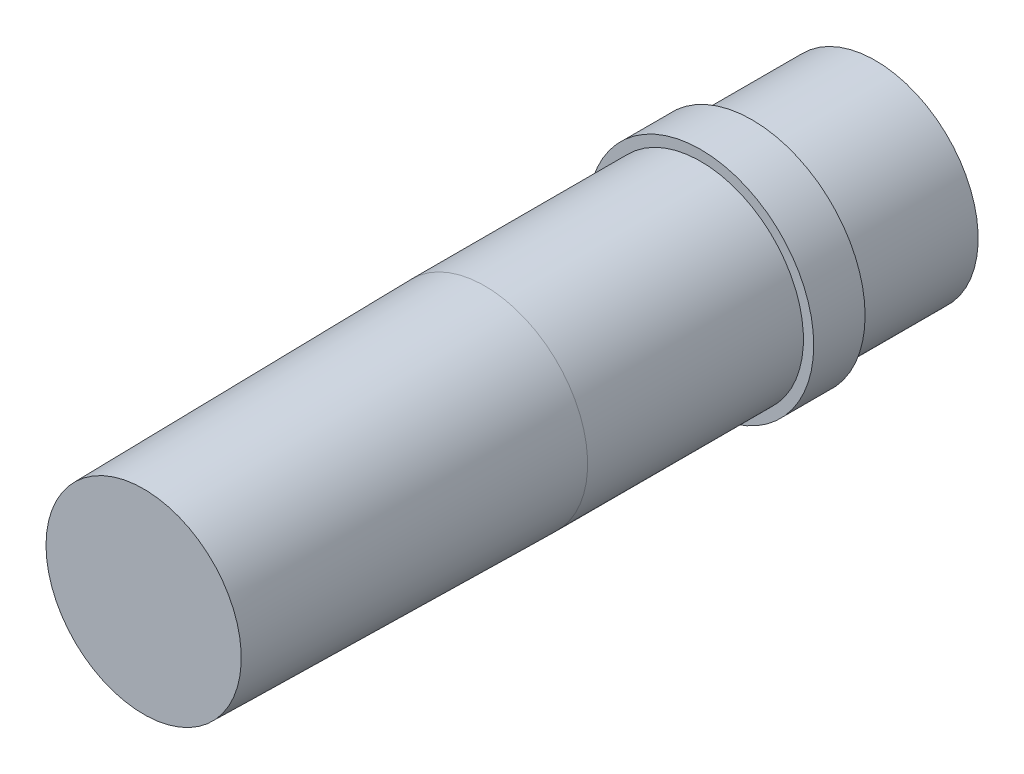
ISO-10303-21;
HEADER;
FILE_DESCRIPTION(('STEP AP214'),'2;1');
FILE_NAME('part.step','',(''),(''),'','','');
FILE_SCHEMA(('AUTOMOTIVE_DESIGN { 1 0 10303 214 1 1 1 1 }'));
ENDSEC;
DATA;
#1=APPLICATION_CONTEXT('core data for automotive mechanical design processes');
#2=APPLICATION_PROTOCOL_DEFINITION('international standard','automotive_design',2000,#1);
#3=PRODUCT_CONTEXT('',#1,'mechanical');
#4=PRODUCT('Part','Part','',(#3));
#5=PRODUCT_RELATED_PRODUCT_CATEGORY('part','',(#4));
#6=PRODUCT_DEFINITION_FORMATION('','',#4);
#7=PRODUCT_DEFINITION_CONTEXT('part definition',#1,'design');
#8=PRODUCT_DEFINITION('design','',#6,#7);
#9=PRODUCT_DEFINITION_SHAPE('','',#8);
#10=(LENGTH_UNIT() NAMED_UNIT(*) SI_UNIT(.MILLI.,.METRE.));
#11=(NAMED_UNIT(*) PLANE_ANGLE_UNIT() SI_UNIT($,.RADIAN.));
#12=(NAMED_UNIT(*) SI_UNIT($,.STERADIAN.) SOLID_ANGLE_UNIT());
#13=UNCERTAINTY_MEASURE_WITH_UNIT(LENGTH_MEASURE(1.E-05),#10,'distance_accuracy_value','');
#14=(GEOMETRIC_REPRESENTATION_CONTEXT(3) GLOBAL_UNCERTAINTY_ASSIGNED_CONTEXT((#13)) GLOBAL_UNIT_ASSIGNED_CONTEXT((#10,
#11,#12)) REPRESENTATION_CONTEXT('',''));
#15=CARTESIAN_POINT('',(0.,0.,0.));
#16=DIRECTION('',(0.,0.,1.));
#17=DIRECTION('',(1.,0.,0.));
#18=AXIS2_PLACEMENT_3D('',#15,#16,#17);
#19=CARTESIAN_POINT('',(0.,0.,-3.56));
#20=DIRECTION('',(0.,0.,-1.));
#21=DIRECTION('',(-1.,0.,0.));
#22=AXIS2_PLACEMENT_3D('',#19,#20,#21);
#23=PLANE('',#22);
#24=CARTESIAN_POINT('',(0.,0.,-3.56));
#25=DIRECTION('',(0.,0.,-1.));
#26=DIRECTION('',(-1.,0.,0.));
#27=AXIS2_PLACEMENT_3D('',#24,#25,#26);
#28=CIRCLE('',#27,0.425);
#29=CARTESIAN_POINT('',(-0.425,0.,-3.56));
#30=VERTEX_POINT('',#29);
#31=EDGE_CURVE('E60',#30,#30,#28,.T.);
#32=ORIENTED_EDGE('',*,*,#31,.F.);
#33=EDGE_LOOP('',(#32));
#34=FACE_BOUND('',#33,.T.);
#35=CARTESIAN_POINT('',(0.,0.,-3.56));
#36=DIRECTION('',(0.,0.,-1.));
#37=DIRECTION('',(-1.,0.,0.));
#38=AXIS2_PLACEMENT_3D('',#35,#36,#37);
#39=CIRCLE('',#38,0.5);
#40=CARTESIAN_POINT('',(-0.5,0.,-3.56));
#41=VERTEX_POINT('',#40);
#42=EDGE_CURVE('E10',#41,#41,#39,.T.);
#43=ORIENTED_EDGE('',*,*,#42,.T.);
#44=EDGE_LOOP('',(#43));
#45=FACE_BOUND('',#44,.T.);
#46=ADVANCED_FACE('F31',(#34,#45),#23,.T.);
#47=CARTESIAN_POINT('',(0.,0.,-1.59981087316398));
#48=DIRECTION('',(0.,0.,-1.));
#49=DIRECTION('',(-1.,0.,0.));
#50=AXIS2_PLACEMENT_3D('',#47,#48,#49);
#51=CYLINDRICAL_SURFACE('',#50,0.5);
#52=CARTESIAN_POINT('',(0.,0.,-2.96));
#53=DIRECTION('',(0.,0.,-1.));
#54=DIRECTION('',(-1.,0.,0.));
#55=AXIS2_PLACEMENT_3D('',#52,#53,#54);
#56=CIRCLE('',#55,0.5);
#57=CARTESIAN_POINT('',(-0.5,0.,-2.96));
#58=VERTEX_POINT('',#57);
#59=EDGE_CURVE('E37',#58,#58,#56,.T.);
#60=ORIENTED_EDGE('',*,*,#59,.T.);
#61=EDGE_LOOP('',(#60));
#62=FACE_BOUND('',#61,.T.);
#63=ORIENTED_EDGE('',*,*,#42,.F.);
#64=EDGE_LOOP('',(#63));
#65=FACE_BOUND('',#64,.T.);
#66=ADVANCED_FACE('F76',(#62,#65),#51,.T.);
#67=CARTESIAN_POINT('',(-0.5,0.,-2.96));
#68=DIRECTION('',(0.,0.,-1.));
#69=DIRECTION('',(-1.,0.,0.));
#70=AXIS2_PLACEMENT_3D('',#67,#68,#69);
#71=PLANE('',#70);
#72=CARTESIAN_POINT('',(0.,0.,-2.96));
#73=DIRECTION('',(0.,0.,-1.));
#74=DIRECTION('',(-1.,0.,0.));
#75=AXIS2_PLACEMENT_3D('',#72,#73,#74);
#76=CIRCLE('',#75,0.55);
#77=CARTESIAN_POINT('',(-0.55,0.,-2.96));
#78=VERTEX_POINT('',#77);
#79=EDGE_CURVE('E41',#78,#78,#76,.T.);
#80=ORIENTED_EDGE('',*,*,#79,.T.);
#81=EDGE_LOOP('',(#80));
#82=FACE_BOUND('',#81,.T.);
#83=ORIENTED_EDGE('',*,*,#59,.F.);
#84=EDGE_LOOP('',(#83));
#85=FACE_BOUND('',#84,.T.);
#86=ADVANCED_FACE('F80',(#82,#85),#71,.T.);
#87=CARTESIAN_POINT('',(0.,0.,-1.59981087316398));
#88=DIRECTION('',(0.,0.,-1.));
#89=DIRECTION('',(-1.,0.,0.));
#90=AXIS2_PLACEMENT_3D('',#87,#88,#89);
#91=CYLINDRICAL_SURFACE('',#90,0.55);
#92=CARTESIAN_POINT('',(0.,0.,-2.71));
#93=DIRECTION('',(0.,0.,-1.));
#94=DIRECTION('',(-1.,0.,0.));
#95=AXIS2_PLACEMENT_3D('',#92,#93,#94);
#96=CIRCLE('',#95,0.55);
#97=CARTESIAN_POINT('',(-0.55,0.,-2.71));
#98=VERTEX_POINT('',#97);
#99=EDGE_CURVE('E45',#98,#98,#96,.T.);
#100=ORIENTED_EDGE('',*,*,#99,.T.);
#101=EDGE_LOOP('',(#100));
#102=FACE_BOUND('',#101,.T.);
#103=ORIENTED_EDGE('',*,*,#79,.F.);
#104=EDGE_LOOP('',(#103));
#105=FACE_BOUND('',#104,.T.);
#106=ADVANCED_FACE('F84',(#102,#105),#91,.T.);
#107=CARTESIAN_POINT('',(-0.55,0.,-2.71));
#108=DIRECTION('',(0.,0.,1.));
#109=DIRECTION('',(1.,0.,0.));
#110=AXIS2_PLACEMENT_3D('',#107,#108,#109);
#111=PLANE('',#110);
#112=CARTESIAN_POINT('',(0.,0.,-2.71));
#113=DIRECTION('',(0.,0.,-1.));
#114=DIRECTION('',(-1.,0.,0.));
#115=AXIS2_PLACEMENT_3D('',#112,#113,#114);
#116=CIRCLE('',#115,0.5);
#117=CARTESIAN_POINT('',(-0.5,0.,-2.71));
#118=VERTEX_POINT('',#117);
#119=EDGE_CURVE('E50',#118,#118,#116,.T.);
#120=ORIENTED_EDGE('',*,*,#119,.T.);
#121=EDGE_LOOP('',(#120));
#122=FACE_BOUND('',#121,.T.);
#123=ORIENTED_EDGE('',*,*,#99,.F.);
#124=EDGE_LOOP('',(#123));
#125=FACE_BOUND('',#124,.T.);
#126=ADVANCED_FACE('F91',(#122,#125),#111,.T.);
#127=CARTESIAN_POINT('',(0.,0.,-1.59981087316398));
#128=DIRECTION('',(0.,0.,-1.));
#129=DIRECTION('',(-1.,0.,0.));
#130=AXIS2_PLACEMENT_3D('',#127,#128,#129);
#131=CYLINDRICAL_SURFACE('',#130,0.5);
#132=CARTESIAN_POINT('',(0.,0.,-1.66));
#133=DIRECTION('',(0.,0.,-1.));
#134=DIRECTION('',(-1.,0.,0.));
#135=AXIS2_PLACEMENT_3D('',#132,#133,#134);
#136=CIRCLE('',#135,0.5);
#137=CARTESIAN_POINT('',(-0.5,0.,-1.66));
#138=VERTEX_POINT('',#137);
#139=EDGE_CURVE('E53',#138,#138,#136,.T.);
#140=ORIENTED_EDGE('',*,*,#139,.T.);
#141=EDGE_LOOP('',(#140));
#142=FACE_BOUND('',#141,.T.);
#143=ORIENTED_EDGE('',*,*,#119,.F.);
#144=EDGE_LOOP('',(#143));
#145=FACE_BOUND('',#144,.T.);
#146=ADVANCED_FACE('F95',(#142,#145),#131,.T.);
#147=CARTESIAN_POINT('',(0.,0.,-1.66));
#148=DIRECTION('',(0.,0.,-1.));
#149=DIRECTION('',(-1.,0.,0.));
#150=AXIS2_PLACEMENT_3D('',#147,#148,#149);
#151=CONICAL_SURFACE('',#150,0.5,0.0150591025100552);
#152=CARTESIAN_POINT('',(0.,0.,0.));
#153=DIRECTION('',(0.,0.,-1.));
#154=DIRECTION('',(-1.,0.,0.));
#155=AXIS2_PLACEMENT_3D('',#152,#153,#154);
#156=CIRCLE('',#155,0.475);
#157=CARTESIAN_POINT('',(-0.475,0.,0.));
#158=VERTEX_POINT('',#157);
#159=EDGE_CURVE('E56',#158,#158,#156,.T.);
#160=ORIENTED_EDGE('',*,*,#159,.T.);
#161=EDGE_LOOP('',(#160));
#162=FACE_BOUND('',#161,.T.);
#163=ORIENTED_EDGE('',*,*,#139,.F.);
#164=EDGE_LOOP('',(#163));
#165=FACE_BOUND('',#164,.T.);
#166=ADVANCED_FACE('F99',(#162,#165),#151,.T.);
#167=CARTESIAN_POINT('',(-0.475,0.,0.));
#168=DIRECTION('',(0.,0.,1.));
#169=DIRECTION('',(1.,0.,0.));
#170=AXIS2_PLACEMENT_3D('',#167,#168,#169);
#171=PLANE('',#170);
#172=ORIENTED_EDGE('',*,*,#159,.F.);
#173=EDGE_LOOP('',(#172));
#174=FACE_BOUND('',#173,.T.);
#175=ADVANCED_FACE('F71',(#174),#171,.T.);
#176=CARTESIAN_POINT('',(0.,0.,-2.06));
#177=DIRECTION('',(0.,0.,-1.));
#178=DIRECTION('',(-1.,0.,0.));
#179=AXIS2_PLACEMENT_3D('',#176,#177,#178);
#180=CYLINDRICAL_SURFACE('',#179,0.425);
#181=CARTESIAN_POINT('',(0.,0.,-2.06));
#182=DIRECTION('',(0.,0.,-1.));
#183=DIRECTION('',(-1.,0.,0.));
#184=AXIS2_PLACEMENT_3D('',#181,#182,#183);
#185=CIRCLE('',#184,0.425);
#186=CARTESIAN_POINT('',(-0.425,0.,-2.06));
#187=VERTEX_POINT('',#186);
#188=EDGE_CURVE('E59',#187,#187,#185,.T.);
#189=ORIENTED_EDGE('',*,*,#188,.F.);
#190=EDGE_LOOP('',(#189));
#191=FACE_BOUND('',#190,.T.);
#192=ORIENTED_EDGE('',*,*,#31,.T.);
#193=EDGE_LOOP('',(#192));
#194=FACE_BOUND('',#193,.T.);
#195=ADVANCED_FACE('F68',(#191,#194),#180,.F.);
#196=CARTESIAN_POINT('',(0.,0.,-2.06));
#197=DIRECTION('',(0.,0.,-1.));
#198=DIRECTION('',(-1.,0.,0.));
#199=AXIS2_PLACEMENT_3D('',#196,#197,#198);
#200=PLANE('',#199);
#201=ORIENTED_EDGE('',*,*,#188,.T.);
#202=EDGE_LOOP('',(#201));
#203=FACE_BOUND('',#202,.T.);
#204=ADVANCED_FACE('F66',(#203),#200,.T.);
#205=CLOSED_SHELL('',(#46,#66,#86,#106,#126,#146,#166,#175,#195,#204));
#206=MANIFOLD_SOLID_BREP('B2',#205);
#207=ADVANCED_BREP_SHAPE_REPRESENTATION('',(#18,#206),#14);
#208=SHAPE_DEFINITION_REPRESENTATION(#9,#207);
ENDSEC;
END-ISO-10303-21;
